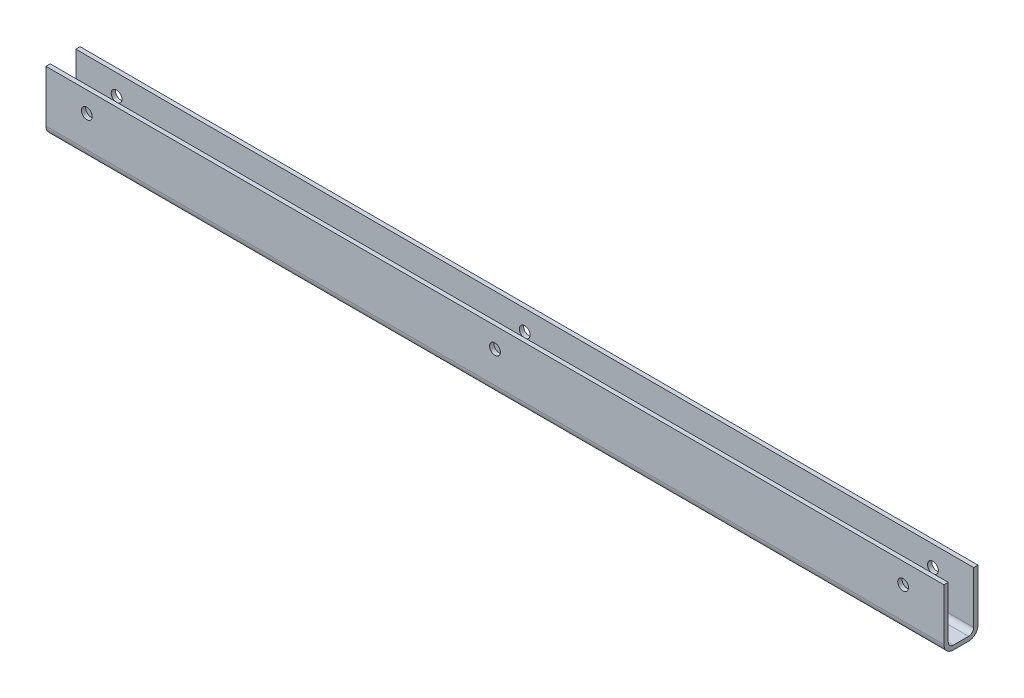
ISO-10303-21;
HEADER;
FILE_DESCRIPTION(('STEP AP214'),'2;1');
FILE_NAME('part.step','',(''),(''),'','','');
FILE_SCHEMA(('AUTOMOTIVE_DESIGN { 1 0 10303 214 1 1 1 1 }'));
ENDSEC;
DATA;
#1=APPLICATION_CONTEXT('core data for automotive mechanical design processes');
#2=APPLICATION_PROTOCOL_DEFINITION('international standard','automotive_design',2000,#1);
#3=PRODUCT_CONTEXT('',#1,'mechanical');
#4=PRODUCT('Part','Part','',(#3));
#5=PRODUCT_RELATED_PRODUCT_CATEGORY('part','',(#4));
#6=PRODUCT_DEFINITION_FORMATION('','',#4);
#7=PRODUCT_DEFINITION_CONTEXT('part definition',#1,'design');
#8=PRODUCT_DEFINITION('design','',#6,#7);
#9=PRODUCT_DEFINITION_SHAPE('','',#8);
#10=(LENGTH_UNIT() NAMED_UNIT(*) SI_UNIT(.MILLI.,.METRE.));
#11=(NAMED_UNIT(*) PLANE_ANGLE_UNIT() SI_UNIT($,.RADIAN.));
#12=(NAMED_UNIT(*) SI_UNIT($,.STERADIAN.) SOLID_ANGLE_UNIT());
#13=UNCERTAINTY_MEASURE_WITH_UNIT(LENGTH_MEASURE(1.E-05),#10,'distance_accuracy_value','');
#14=(GEOMETRIC_REPRESENTATION_CONTEXT(3) GLOBAL_UNCERTAINTY_ASSIGNED_CONTEXT((#13)) GLOBAL_UNIT_ASSIGNED_CONTEXT((#10,
#11,#12)) REPRESENTATION_CONTEXT('',''));
#15=CARTESIAN_POINT('',(0.,0.,0.));
#16=DIRECTION('',(0.,0.,1.));
#17=DIRECTION('',(1.,0.,0.));
#18=AXIS2_PLACEMENT_3D('',#15,#16,#17);
#19=CARTESIAN_POINT('',(25.4,25.4,0.));
#20=DIRECTION('',(0.,0.,1.));
#21=DIRECTION('',(1.,0.,0.));
#22=AXIS2_PLACEMENT_3D('',#19,#20,#21);
#23=CYLINDRICAL_SURFACE('',#22,3.3655);
#24=CARTESIAN_POINT('',(25.4,25.4,-2.65684));
#25=DIRECTION('',(0.,0.,1.));
#26=DIRECTION('',(1.,0.,0.));
#27=AXIS2_PLACEMENT_3D('',#24,#25,#26);
#28=CIRCLE('',#27,3.3655);
#29=CARTESIAN_POINT('',(28.7655,25.4,-2.65684));
#30=VERTEX_POINT('',#29);
#31=EDGE_CURVE('E19',#30,#30,#28,.T.);
#32=ORIENTED_EDGE('',*,*,#31,.F.);
#33=EDGE_LOOP('',(#32));
#34=FACE_BOUND('',#33,.T.);
#35=CARTESIAN_POINT('',(25.4,25.4,0.));
#36=DIRECTION('',(0.,0.,1.));
#37=DIRECTION('',(1.,0.,0.));
#38=AXIS2_PLACEMENT_3D('',#35,#36,#37);
#39=CIRCLE('',#38,3.3655);
#40=CARTESIAN_POINT('',(28.7655,25.4,0.));
#41=VERTEX_POINT('',#40);
#42=EDGE_CURVE('E143',#41,#41,#39,.F.);
#43=ORIENTED_EDGE('',*,*,#42,.F.);
#44=EDGE_LOOP('',(#43));
#45=FACE_BOUND('',#44,.T.);
#46=ADVANCED_FACE('F16',(#34,#45),#23,.F.);
#47=CARTESIAN_POINT('',(279.4,25.4,0.));
#48=DIRECTION('',(0.,0.,1.));
#49=DIRECTION('',(1.,0.,0.));
#50=AXIS2_PLACEMENT_3D('',#47,#48,#49);
#51=CYLINDRICAL_SURFACE('',#50,3.3655);
#52=CARTESIAN_POINT('',(279.4,25.4,-2.65684));
#53=DIRECTION('',(0.,0.,1.));
#54=DIRECTION('',(1.,0.,0.));
#55=AXIS2_PLACEMENT_3D('',#52,#53,#54);
#56=CIRCLE('',#55,3.3655);
#57=CARTESIAN_POINT('',(282.7655,25.4,-2.65684));
#58=VERTEX_POINT('',#57);
#59=EDGE_CURVE('E150',#58,#58,#56,.T.);
#60=ORIENTED_EDGE('',*,*,#59,.F.);
#61=EDGE_LOOP('',(#60));
#62=FACE_BOUND('',#61,.T.);
#63=CARTESIAN_POINT('',(279.4,25.4,0.));
#64=DIRECTION('',(0.,0.,1.));
#65=DIRECTION('',(1.,0.,0.));
#66=AXIS2_PLACEMENT_3D('',#63,#64,#65);
#67=CIRCLE('',#66,3.3655);
#68=CARTESIAN_POINT('',(282.7655,25.4,0.));
#69=VERTEX_POINT('',#68);
#70=EDGE_CURVE('E140',#69,#69,#67,.F.);
#71=ORIENTED_EDGE('',*,*,#70,.F.);
#72=EDGE_LOOP('',(#71));
#73=FACE_BOUND('',#72,.T.);
#74=ADVANCED_FACE('F467',(#62,#73),#51,.F.);
#75=CARTESIAN_POINT('',(533.4,25.4,0.));
#76=DIRECTION('',(0.,0.,1.));
#77=DIRECTION('',(1.,0.,0.));
#78=AXIS2_PLACEMENT_3D('',#75,#76,#77);
#79=CYLINDRICAL_SURFACE('',#78,3.3655);
#80=CARTESIAN_POINT('',(533.4,25.4,-2.65684));
#81=DIRECTION('',(0.,0.,1.));
#82=DIRECTION('',(1.,0.,0.));
#83=AXIS2_PLACEMENT_3D('',#80,#81,#82);
#84=CIRCLE('',#83,3.3655);
#85=CARTESIAN_POINT('',(536.7655,25.4,-2.65684));
#86=VERTEX_POINT('',#85);
#87=EDGE_CURVE('E147',#86,#86,#84,.T.);
#88=ORIENTED_EDGE('',*,*,#87,.F.);
#89=EDGE_LOOP('',(#88));
#90=FACE_BOUND('',#89,.T.);
#91=CARTESIAN_POINT('',(533.4,25.4,0.));
#92=DIRECTION('',(0.,0.,1.));
#93=DIRECTION('',(1.,0.,0.));
#94=AXIS2_PLACEMENT_3D('',#91,#92,#93);
#95=CIRCLE('',#94,3.3655);
#96=CARTESIAN_POINT('',(536.7655,25.4,0.));
#97=VERTEX_POINT('',#96);
#98=EDGE_CURVE('E136',#97,#97,#95,.F.);
#99=ORIENTED_EDGE('',*,*,#98,.F.);
#100=EDGE_LOOP('',(#99));
#101=FACE_BOUND('',#100,.T.);
#102=ADVANCED_FACE('F458',(#90,#101),#79,.F.);
#103=CARTESIAN_POINT('',(0.,2.65684,-18.53184));
#104=DIRECTION('',(0.,1.,0.));
#105=DIRECTION('',(0.,0.,1.));
#106=AXIS2_PLACEMENT_3D('',#103,#104,#105);
#107=PLANE('',#106);
#108=DIRECTION('',(1.,0.,0.));
#109=VECTOR('',#108,1.);
#110=CARTESIAN_POINT('',(-728.45168,2.65684,-5.83184));
#111=LINE('',#110,#109);
#112=CARTESIAN_POINT('',(0.,2.65684,-5.83184));
#113=VERTEX_POINT('',#112);
#114=CARTESIAN_POINT('',(558.8,2.65684,-5.83184));
#115=VERTEX_POINT('',#114);
#116=EDGE_CURVE('E159',#113,#115,#111,.T.);
#117=ORIENTED_EDGE('',*,*,#116,.T.);
#118=DIRECTION('',(0.,0.,-1.));
#119=VECTOR('',#118,1.);
#120=CARTESIAN_POINT('',(558.8,2.65684,0.));
#121=LINE('',#120,#119);
#122=CARTESIAN_POINT('',(558.8,2.65684,-15.35684));
#123=VERTEX_POINT('',#122);
#124=EDGE_CURVE('E212',#123,#115,#121,.F.);
#125=ORIENTED_EDGE('',*,*,#124,.F.);
#126=DIRECTION('',(1.,0.,0.));
#127=VECTOR('',#126,1.);
#128=CARTESIAN_POINT('',(-728.45168,2.65684,-15.35684));
#129=LINE('',#128,#127);
#130=CARTESIAN_POINT('',(0.,2.65684,-15.35684));
#131=VERTEX_POINT('',#130);
#132=EDGE_CURVE('E118',#123,#131,#129,.F.);
#133=ORIENTED_EDGE('',*,*,#132,.T.);
#134=DIRECTION('',(0.,0.,-1.));
#135=VECTOR('',#134,1.);
#136=CARTESIAN_POINT('',(0.,2.65684,0.));
#137=LINE('',#136,#135);
#138=EDGE_CURVE('E205',#131,#113,#137,.F.);
#139=ORIENTED_EDGE('',*,*,#138,.T.);
#140=EDGE_LOOP('',(#117,#125,#133,#139));
#141=FACE_BOUND('',#140,.T.);
#142=ADVANCED_FACE('F449',(#141),#107,.T.);
#143=CARTESIAN_POINT('',(-728.45168,5.83184,-5.83184));
#144=DIRECTION('',(1.,0.,0.));
#145=DIRECTION('',(0.,0.,-1.));
#146=AXIS2_PLACEMENT_3D('',#143,#144,#145);
#147=CYLINDRICAL_SURFACE('',#146,3.175);
#148=CARTESIAN_POINT('',(558.8,5.83184,-5.83184));
#149=DIRECTION('',(1.,0.,0.));
#150=DIRECTION('',(0.,0.,-1.));
#151=AXIS2_PLACEMENT_3D('',#148,#149,#150);
#152=CIRCLE('',#151,3.175);
#153=CARTESIAN_POINT('',(558.8,5.83184,-2.65684));
#154=VERTEX_POINT('',#153);
#155=EDGE_CURVE('E210',#115,#154,#152,.F.);
#156=ORIENTED_EDGE('',*,*,#155,.F.);
#157=ORIENTED_EDGE('',*,*,#116,.F.);
#158=CARTESIAN_POINT('',(0.,5.83184,-5.83184));
#159=DIRECTION('',(1.,0.,0.));
#160=DIRECTION('',(0.,0.,-1.));
#161=AXIS2_PLACEMENT_3D('',#158,#159,#160);
#162=CIRCLE('',#161,3.175);
#163=CARTESIAN_POINT('',(0.,5.83184,-2.65684));
#164=VERTEX_POINT('',#163);
#165=EDGE_CURVE('E202',#113,#164,#162,.F.);
#166=ORIENTED_EDGE('',*,*,#165,.T.);
#167=DIRECTION('',(-1.,0.,0.));
#168=VECTOR('',#167,1.);
#169=CARTESIAN_POINT('',(0.,5.83184,-2.65684));
#170=LINE('',#169,#168);
#171=EDGE_CURVE('E155',#154,#164,#170,.T.);
#172=ORIENTED_EDGE('',*,*,#171,.F.);
#173=EDGE_LOOP('',(#156,#157,#166,#172));
#174=FACE_BOUND('',#173,.T.);
#175=ADVANCED_FACE('F440',(#174),#147,.F.);
#176=CARTESIAN_POINT('',(0.,2.65684,-2.65684));
#177=DIRECTION('',(0.,0.,-1.));
#178=DIRECTION('',(-1.,0.,0.));
#179=AXIS2_PLACEMENT_3D('',#176,#177,#178);
#180=PLANE('',#179);
#181=ORIENTED_EDGE('',*,*,#87,.T.);
#182=EDGE_LOOP('',(#181));
#183=FACE_BOUND('',#182,.T.);
#184=ORIENTED_EDGE('',*,*,#59,.T.);
#185=EDGE_LOOP('',(#184));
#186=FACE_BOUND('',#185,.T.);
#187=ORIENTED_EDGE('',*,*,#31,.T.);
#188=EDGE_LOOP('',(#187));
#189=FACE_BOUND('',#188,.T.);
#190=DIRECTION('',(1.,0.,0.));
#191=VECTOR('',#190,1.);
#192=CARTESIAN_POINT('',(0.,38.1,-2.65684));
#193=LINE('',#192,#191);
#194=CARTESIAN_POINT('',(558.8,38.1,-2.65684));
#195=VERTEX_POINT('',#194);
#196=CARTESIAN_POINT('',(0.,38.1,-2.65684));
#197=VERTEX_POINT('',#196);
#198=EDGE_CURVE('E149',#195,#197,#193,.F.);
#199=ORIENTED_EDGE('',*,*,#198,.F.);
#200=DIRECTION('',(0.,1.,0.));
#201=VECTOR('',#200,1.);
#202=CARTESIAN_POINT('',(558.8,0.,-2.65684));
#203=LINE('',#202,#201);
#204=EDGE_CURVE('E178',#154,#195,#203,.T.);
#205=ORIENTED_EDGE('',*,*,#204,.F.);
#206=ORIENTED_EDGE('',*,*,#171,.T.);
#207=DIRECTION('',(0.,1.,0.));
#208=VECTOR('',#207,1.);
#209=CARTESIAN_POINT('',(0.,0.,-2.65684));
#210=LINE('',#209,#208);
#211=EDGE_CURVE('E204',#164,#197,#210,.T.);
#212=ORIENTED_EDGE('',*,*,#211,.T.);
#213=EDGE_LOOP('',(#199,#205,#206,#212));
#214=FACE_BOUND('',#213,.T.);
#215=ADVANCED_FACE('F432',(#183,#186,#189,#214),#180,.T.);
#216=CARTESIAN_POINT('',(0.,38.1,-2.65684));
#217=DIRECTION('',(0.,1.,0.));
#218=DIRECTION('',(0.,0.,1.));
#219=AXIS2_PLACEMENT_3D('',#216,#217,#218);
#220=PLANE('',#219);
#221=DIRECTION('',(0.,0.,-1.));
#222=VECTOR('',#221,1.);
#223=CARTESIAN_POINT('',(558.8,38.1,0.));
#224=LINE('',#223,#222);
#225=CARTESIAN_POINT('',(558.8,38.1,0.));
#226=VERTEX_POINT('',#225);
#227=EDGE_CURVE('E174',#195,#226,#224,.F.);
#228=ORIENTED_EDGE('',*,*,#227,.F.);
#229=ORIENTED_EDGE('',*,*,#198,.T.);
#230=DIRECTION('',(0.,0.,-1.));
#231=VECTOR('',#230,1.);
#232=CARTESIAN_POINT('',(0.,38.1,0.));
#233=LINE('',#232,#231);
#234=CARTESIAN_POINT('',(0.,38.1,0.));
#235=VERTEX_POINT('',#234);
#236=EDGE_CURVE('E235',#197,#235,#233,.F.);
#237=ORIENTED_EDGE('',*,*,#236,.T.);
#238=DIRECTION('',(1.,0.,0.));
#239=VECTOR('',#238,1.);
#240=CARTESIAN_POINT('',(0.,38.1,0.));
#241=LINE('',#240,#239);
#242=EDGE_CURVE('E146',#226,#235,#241,.F.);
#243=ORIENTED_EDGE('',*,*,#242,.F.);
#244=EDGE_LOOP('',(#228,#229,#237,#243));
#245=FACE_BOUND('',#244,.T.);
#246=ADVANCED_FACE('F242',(#245),#220,.T.);
#247=CARTESIAN_POINT('',(0.,38.1,0.));
#248=DIRECTION('',(0.,0.,1.));
#249=DIRECTION('',(1.,0.,0.));
#250=AXIS2_PLACEMENT_3D('',#247,#248,#249);
#251=PLANE('',#250);
#252=ORIENTED_EDGE('',*,*,#98,.T.);
#253=EDGE_LOOP('',(#252));
#254=FACE_BOUND('',#253,.T.);
#255=ORIENTED_EDGE('',*,*,#70,.T.);
#256=EDGE_LOOP('',(#255));
#257=FACE_BOUND('',#256,.T.);
#258=ORIENTED_EDGE('',*,*,#42,.T.);
#259=EDGE_LOOP('',(#258));
#260=FACE_BOUND('',#259,.T.);
#261=ORIENTED_EDGE('',*,*,#242,.T.);
#262=DIRECTION('',(0.,1.,0.));
#263=VECTOR('',#262,1.);
#264=CARTESIAN_POINT('',(0.,0.,0.));
#265=LINE('',#264,#263);
#266=CARTESIAN_POINT('',(0.,5.842,0.));
#267=VERTEX_POINT('',#266);
#268=EDGE_CURVE('E201',#235,#267,#265,.F.);
#269=ORIENTED_EDGE('',*,*,#268,.T.);
#270=DIRECTION('',(-1.,0.,0.));
#271=VECTOR('',#270,1.);
#272=CARTESIAN_POINT('',(1287.25168,5.842,0.));
#273=LINE('',#272,#271);
#274=CARTESIAN_POINT('',(558.8,5.842,0.));
#275=VERTEX_POINT('',#274);
#276=EDGE_CURVE('E139',#275,#267,#273,.T.);
#277=ORIENTED_EDGE('',*,*,#276,.F.);
#278=DIRECTION('',(0.,1.,0.));
#279=VECTOR('',#278,1.);
#280=CARTESIAN_POINT('',(558.8,0.,0.));
#281=LINE('',#280,#279);
#282=EDGE_CURVE('E177',#226,#275,#281,.F.);
#283=ORIENTED_EDGE('',*,*,#282,.F.);
#284=EDGE_LOOP('',(#261,#269,#277,#283));
#285=FACE_BOUND('',#284,.T.);
#286=ADVANCED_FACE('F290',(#254,#257,#260,#285),#251,.T.);
#287=CARTESIAN_POINT('',(1287.25168,5.842,-5.842));
#288=DIRECTION('',(-1.,0.,0.));
#289=DIRECTION('',(0.,0.,1.));
#290=AXIS2_PLACEMENT_3D('',#287,#288,#289);
#291=CYLINDRICAL_SURFACE('',#290,5.842);
#292=CARTESIAN_POINT('',(558.8,5.842,-5.842));
#293=DIRECTION('',(-1.,0.,0.));
#294=DIRECTION('',(0.,0.,1.));
#295=AXIS2_PLACEMENT_3D('',#292,#293,#294);
#296=CIRCLE('',#295,5.842);
#297=CARTESIAN_POINT('',(558.8,0.,-5.842));
#298=VERTEX_POINT('',#297);
#299=EDGE_CURVE('E209',#275,#298,#296,.F.);
#300=ORIENTED_EDGE('',*,*,#299,.F.);
#301=ORIENTED_EDGE('',*,*,#276,.T.);
#302=CARTESIAN_POINT('',(0.,5.842,-5.842));
#303=DIRECTION('',(-1.,0.,0.));
#304=DIRECTION('',(0.,0.,1.));
#305=AXIS2_PLACEMENT_3D('',#302,#303,#304);
#306=CIRCLE('',#305,5.842);
#307=CARTESIAN_POINT('',(0.,0.,-5.842));
#308=VERTEX_POINT('',#307);
#309=EDGE_CURVE('E199',#267,#308,#306,.F.);
#310=ORIENTED_EDGE('',*,*,#309,.T.);
#311=DIRECTION('',(1.,0.,0.));
#312=VECTOR('',#311,1.);
#313=CARTESIAN_POINT('',(0.,0.,-5.842));
#314=LINE('',#313,#312);
#315=EDGE_CURVE('E226',#298,#308,#314,.F.);
#316=ORIENTED_EDGE('',*,*,#315,.F.);
#317=EDGE_LOOP('',(#300,#301,#310,#316));
#318=FACE_BOUND('',#317,.T.);
#319=ADVANCED_FACE('F292',(#318),#291,.T.);
#320=CARTESIAN_POINT('',(0.,0.,0.));
#321=DIRECTION('',(0.,-1.,0.));
#322=DIRECTION('',(0.,0.,-1.));
#323=AXIS2_PLACEMENT_3D('',#320,#321,#322);
#324=PLANE('',#323);
#325=ORIENTED_EDGE('',*,*,#315,.T.);
#326=DIRECTION('',(0.,0.,-1.));
#327=VECTOR('',#326,1.);
#328=CARTESIAN_POINT('',(0.,0.,0.));
#329=LINE('',#328,#327);
#330=CARTESIAN_POINT('',(0.,0.,-15.34668));
#331=VERTEX_POINT('',#330);
#332=EDGE_CURVE('E198',#308,#331,#329,.T.);
#333=ORIENTED_EDGE('',*,*,#332,.T.);
#334=DIRECTION('',(-1.,0.,0.));
#335=VECTOR('',#334,1.);
#336=CARTESIAN_POINT('',(1287.25168,0.,-15.34668));
#337=LINE('',#336,#335);
#338=CARTESIAN_POINT('',(558.8,0.,-15.34668));
#339=VERTEX_POINT('',#338);
#340=EDGE_CURVE('E103',#339,#331,#337,.T.);
#341=ORIENTED_EDGE('',*,*,#340,.F.);
#342=DIRECTION('',(0.,0.,-1.));
#343=VECTOR('',#342,1.);
#344=CARTESIAN_POINT('',(558.8,0.,0.));
#345=LINE('',#344,#343);
#346=EDGE_CURVE('E130',#298,#339,#345,.T.);
#347=ORIENTED_EDGE('',*,*,#346,.F.);
#348=EDGE_LOOP('',(#325,#333,#341,#347));
#349=FACE_BOUND('',#348,.T.);
#350=ADVANCED_FACE('F293',(#349),#324,.T.);
#351=CARTESIAN_POINT('',(1287.25168,5.842,-15.34668));
#352=DIRECTION('',(-1.,0.,0.));
#353=DIRECTION('',(0.,0.,1.));
#354=AXIS2_PLACEMENT_3D('',#351,#352,#353);
#355=CYLINDRICAL_SURFACE('',#354,5.842);
#356=CARTESIAN_POINT('',(558.8,5.842,-15.34668));
#357=DIRECTION('',(-1.,0.,0.));
#358=DIRECTION('',(0.,0.,1.));
#359=AXIS2_PLACEMENT_3D('',#356,#357,#358);
#360=CIRCLE('',#359,5.842);
#361=CARTESIAN_POINT('',(558.8,5.842,-21.18868));
#362=VERTEX_POINT('',#361);
#363=EDGE_CURVE('E112',#339,#362,#360,.F.);
#364=ORIENTED_EDGE('',*,*,#363,.F.);
#365=ORIENTED_EDGE('',*,*,#340,.T.);
#366=CARTESIAN_POINT('',(0.,5.842,-15.34668));
#367=DIRECTION('',(-1.,0.,0.));
#368=DIRECTION('',(0.,0.,1.));
#369=AXIS2_PLACEMENT_3D('',#366,#367,#368);
#370=CIRCLE('',#369,5.842);
#371=CARTESIAN_POINT('',(0.,5.842,-21.18868));
#372=VERTEX_POINT('',#371);
#373=EDGE_CURVE('E115',#331,#372,#370,.F.);
#374=ORIENTED_EDGE('',*,*,#373,.T.);
#375=DIRECTION('',(-1.,0.,0.));
#376=VECTOR('',#375,1.);
#377=CARTESIAN_POINT('',(0.,5.842,-21.18868));
#378=LINE('',#377,#376);
#379=EDGE_CURVE('E108',#362,#372,#378,.T.);
#380=ORIENTED_EDGE('',*,*,#379,.F.);
#381=EDGE_LOOP('',(#364,#365,#374,#380));
#382=FACE_BOUND('',#381,.T.);
#383=ADVANCED_FACE('F110',(#382),#355,.T.);
#384=CARTESIAN_POINT('',(0.,0.,-21.18868));
#385=DIRECTION('',(0.,0.,-1.));
#386=DIRECTION('',(-1.,0.,0.));
#387=AXIS2_PLACEMENT_3D('',#384,#385,#386);
#388=PLANE('',#387);
#389=CARTESIAN_POINT('',(533.4,25.4,-21.18868));
#390=DIRECTION('',(0.,0.,1.));
#391=DIRECTION('',(1.,0.,0.));
#392=AXIS2_PLACEMENT_3D('',#389,#390,#391);
#393=CIRCLE('',#392,3.3655);
#394=CARTESIAN_POINT('',(536.7655,25.4,-21.18868));
#395=VERTEX_POINT('',#394);
#396=EDGE_CURVE('E187',#395,#395,#393,.T.);
#397=ORIENTED_EDGE('',*,*,#396,.T.);
#398=EDGE_LOOP('',(#397));
#399=FACE_BOUND('',#398,.T.);
#400=CARTESIAN_POINT('',(279.4,25.4,-21.18868));
#401=DIRECTION('',(0.,0.,1.));
#402=DIRECTION('',(1.,0.,0.));
#403=AXIS2_PLACEMENT_3D('',#400,#401,#402);
#404=CIRCLE('',#403,3.3655);
#405=CARTESIAN_POINT('',(282.7655,25.4,-21.18868));
#406=VERTEX_POINT('',#405);
#407=EDGE_CURVE('E191',#406,#406,#404,.T.);
#408=ORIENTED_EDGE('',*,*,#407,.T.);
#409=EDGE_LOOP('',(#408));
#410=FACE_BOUND('',#409,.T.);
#411=CARTESIAN_POINT('',(25.4,25.4,-21.18868));
#412=DIRECTION('',(0.,0.,1.));
#413=DIRECTION('',(1.,0.,0.));
#414=AXIS2_PLACEMENT_3D('',#411,#412,#413);
#415=CIRCLE('',#414,3.3655);
#416=CARTESIAN_POINT('',(28.7655,25.4,-21.18868));
#417=VERTEX_POINT('',#416);
#418=EDGE_CURVE('E194',#417,#417,#415,.T.);
#419=ORIENTED_EDGE('',*,*,#418,.T.);
#420=EDGE_LOOP('',(#419));
#421=FACE_BOUND('',#420,.T.);
#422=DIRECTION('',(1.,0.,0.));
#423=VECTOR('',#422,1.);
#424=CARTESIAN_POINT('',(0.,38.1,-21.18868));
#425=LINE('',#424,#423);
#426=CARTESIAN_POINT('',(558.8,38.1,-21.18868));
#427=VERTEX_POINT('',#426);
#428=CARTESIAN_POINT('',(0.,38.1,-21.18868));
#429=VERTEX_POINT('',#428);
#430=EDGE_CURVE('E123',#427,#429,#425,.F.);
#431=ORIENTED_EDGE('',*,*,#430,.F.);
#432=DIRECTION('',(0.,1.,0.));
#433=VECTOR('',#432,1.);
#434=CARTESIAN_POINT('',(558.8,0.,-21.18868));
#435=LINE('',#434,#433);
#436=EDGE_CURVE('E121',#362,#427,#435,.T.);
#437=ORIENTED_EDGE('',*,*,#436,.F.);
#438=ORIENTED_EDGE('',*,*,#379,.T.);
#439=DIRECTION('',(0.,1.,0.));
#440=VECTOR('',#439,1.);
#441=CARTESIAN_POINT('',(0.,0.,-21.18868));
#442=LINE('',#441,#440);
#443=EDGE_CURVE('E170',#372,#429,#442,.T.);
#444=ORIENTED_EDGE('',*,*,#443,.T.);
#445=EDGE_LOOP('',(#431,#437,#438,#444));
#446=FACE_BOUND('',#445,.T.);
#447=ADVANCED_FACE('F122',(#399,#410,#421,#446),#388,.T.);
#448=CARTESIAN_POINT('',(-728.45168,5.83184,-15.35684));
#449=DIRECTION('',(1.,0.,0.));
#450=DIRECTION('',(0.,0.,-1.));
#451=AXIS2_PLACEMENT_3D('',#448,#449,#450);
#452=CYLINDRICAL_SURFACE('',#451,3.175);
#453=CARTESIAN_POINT('',(558.8,5.83184,-15.35684));
#454=DIRECTION('',(1.,0.,0.));
#455=DIRECTION('',(0.,0.,-1.));
#456=AXIS2_PLACEMENT_3D('',#453,#454,#455);
#457=CIRCLE('',#456,3.175);
#458=CARTESIAN_POINT('',(558.8,5.83184,-18.53184));
#459=VERTEX_POINT('',#458);
#460=EDGE_CURVE('E126',#459,#123,#457,.F.);
#461=ORIENTED_EDGE('',*,*,#460,.F.);
#462=DIRECTION('',(1.,0.,0.));
#463=VECTOR('',#462,1.);
#464=CARTESIAN_POINT('',(0.,5.83184,-18.53184));
#465=LINE('',#464,#463);
#466=CARTESIAN_POINT('',(0.,5.83184,-18.53184));
#467=VERTEX_POINT('',#466);
#468=EDGE_CURVE('E190',#467,#459,#465,.T.);
#469=ORIENTED_EDGE('',*,*,#468,.F.);
#470=CARTESIAN_POINT('',(0.,5.83184,-15.35684));
#471=DIRECTION('',(1.,0.,0.));
#472=DIRECTION('',(0.,0.,-1.));
#473=AXIS2_PLACEMENT_3D('',#470,#471,#472);
#474=CIRCLE('',#473,3.175);
#475=EDGE_CURVE('E206',#467,#131,#474,.F.);
#476=ORIENTED_EDGE('',*,*,#475,.T.);
#477=ORIENTED_EDGE('',*,*,#132,.F.);
#478=EDGE_LOOP('',(#461,#469,#476,#477));
#479=FACE_BOUND('',#478,.T.);
#480=ADVANCED_FACE('F330',(#479),#452,.F.);
#481=CARTESIAN_POINT('',(558.8,0.,0.));
#482=DIRECTION('',(1.,0.,0.));
#483=DIRECTION('',(0.,0.,-1.));
#484=AXIS2_PLACEMENT_3D('',#481,#482,#483);
#485=PLANE('',#484);
#486=ORIENTED_EDGE('',*,*,#299,.T.);
#487=ORIENTED_EDGE('',*,*,#346,.T.);
#488=ORIENTED_EDGE('',*,*,#363,.T.);
#489=ORIENTED_EDGE('',*,*,#436,.T.);
#490=DIRECTION('',(0.,0.,1.));
#491=VECTOR('',#490,1.);
#492=CARTESIAN_POINT('',(558.8,38.1,-21.18868));
#493=LINE('',#492,#491);
#494=CARTESIAN_POINT('',(558.8,38.1,-18.53184));
#495=VERTEX_POINT('',#494);
#496=EDGE_CURVE('E171',#495,#427,#493,.F.);
#497=ORIENTED_EDGE('',*,*,#496,.F.);
#498=DIRECTION('',(0.,1.,0.));
#499=VECTOR('',#498,1.);
#500=CARTESIAN_POINT('',(558.8,38.1,-18.53184));
#501=LINE('',#500,#499);
#502=EDGE_CURVE('E264',#459,#495,#501,.T.);
#503=ORIENTED_EDGE('',*,*,#502,.F.);
#504=ORIENTED_EDGE('',*,*,#460,.T.);
#505=ORIENTED_EDGE('',*,*,#124,.T.);
#506=ORIENTED_EDGE('',*,*,#155,.T.);
#507=ORIENTED_EDGE('',*,*,#204,.T.);
#508=ORIENTED_EDGE('',*,*,#227,.T.);
#509=ORIENTED_EDGE('',*,*,#282,.T.);
#510=EDGE_LOOP('',(#486,#487,#488,#489,#497,#503,#504,#505,#506,#507,#508,#509));
#511=FACE_BOUND('',#510,.T.);
#512=ADVANCED_FACE('F129',(#511),#485,.T.);
#513=CARTESIAN_POINT('',(0.,38.1,-21.18868));
#514=DIRECTION('',(0.,1.,0.));
#515=DIRECTION('',(0.,0.,1.));
#516=AXIS2_PLACEMENT_3D('',#513,#514,#515);
#517=PLANE('',#516);
#518=ORIENTED_EDGE('',*,*,#496,.T.);
#519=ORIENTED_EDGE('',*,*,#430,.T.);
#520=DIRECTION('',(0.,0.,-1.));
#521=VECTOR('',#520,1.);
#522=CARTESIAN_POINT('',(0.,38.1,0.));
#523=LINE('',#522,#521);
#524=CARTESIAN_POINT('',(0.,38.1,-18.53184));
#525=VERTEX_POINT('',#524);
#526=EDGE_CURVE('E34',#429,#525,#523,.F.);
#527=ORIENTED_EDGE('',*,*,#526,.T.);
#528=DIRECTION('',(1.,0.,0.));
#529=VECTOR('',#528,1.);
#530=CARTESIAN_POINT('',(0.,38.1,-18.53184));
#531=LINE('',#530,#529);
#532=EDGE_CURVE('E267',#495,#525,#531,.F.);
#533=ORIENTED_EDGE('',*,*,#532,.F.);
#534=EDGE_LOOP('',(#518,#519,#527,#533));
#535=FACE_BOUND('',#534,.T.);
#536=ADVANCED_FACE('F325',(#535),#517,.T.);
#537=CARTESIAN_POINT('',(0.,0.,0.));
#538=DIRECTION('',(1.,0.,0.));
#539=DIRECTION('',(0.,0.,-1.));
#540=AXIS2_PLACEMENT_3D('',#537,#538,#539);
#541=PLANE('',#540);
#542=ORIENTED_EDGE('',*,*,#332,.F.);
#543=ORIENTED_EDGE('',*,*,#309,.F.);
#544=ORIENTED_EDGE('',*,*,#268,.F.);
#545=ORIENTED_EDGE('',*,*,#236,.F.);
#546=ORIENTED_EDGE('',*,*,#211,.F.);
#547=ORIENTED_EDGE('',*,*,#165,.F.);
#548=ORIENTED_EDGE('',*,*,#138,.F.);
#549=ORIENTED_EDGE('',*,*,#475,.F.);
#550=DIRECTION('',(0.,1.,0.));
#551=VECTOR('',#550,1.);
#552=CARTESIAN_POINT('',(0.,38.1,-18.53184));
#553=LINE('',#552,#551);
#554=EDGE_CURVE('E186',#525,#467,#553,.F.);
#555=ORIENTED_EDGE('',*,*,#554,.F.);
#556=ORIENTED_EDGE('',*,*,#526,.F.);
#557=ORIENTED_EDGE('',*,*,#443,.F.);
#558=ORIENTED_EDGE('',*,*,#373,.F.);
#559=EDGE_LOOP('',(#542,#543,#544,#545,#546,#547,#548,#549,#555,#556,#557,#558));
#560=FACE_BOUND('',#559,.T.);
#561=ADVANCED_FACE('F246',(#560),#541,.F.);
#562=CARTESIAN_POINT('',(25.4,25.4,0.));
#563=DIRECTION('',(0.,0.,1.));
#564=DIRECTION('',(1.,0.,0.));
#565=AXIS2_PLACEMENT_3D('',#562,#563,#564);
#566=CYLINDRICAL_SURFACE('',#565,3.3655);
#567=CARTESIAN_POINT('',(25.4,25.4,-18.53184));
#568=DIRECTION('',(0.,0.,1.));
#569=DIRECTION('',(1.,0.,0.));
#570=AXIS2_PLACEMENT_3D('',#567,#568,#569);
#571=CIRCLE('',#570,3.3655);
#572=CARTESIAN_POINT('',(28.7655,25.4,-18.53184));
#573=VERTEX_POINT('',#572);
#574=EDGE_CURVE('E183',#573,#573,#571,.F.);
#575=ORIENTED_EDGE('',*,*,#574,.F.);
#576=EDGE_LOOP('',(#575));
#577=FACE_BOUND('',#576,.T.);
#578=ORIENTED_EDGE('',*,*,#418,.F.);
#579=EDGE_LOOP('',(#578));
#580=FACE_BOUND('',#579,.T.);
#581=ADVANCED_FACE('F318',(#577,#580),#566,.F.);
#582=CARTESIAN_POINT('',(279.4,25.4,0.));
#583=DIRECTION('',(0.,0.,1.));
#584=DIRECTION('',(1.,0.,0.));
#585=AXIS2_PLACEMENT_3D('',#582,#583,#584);
#586=CYLINDRICAL_SURFACE('',#585,3.3655);
#587=CARTESIAN_POINT('',(279.4,25.4,-18.53184));
#588=DIRECTION('',(0.,0.,1.));
#589=DIRECTION('',(1.,0.,0.));
#590=AXIS2_PLACEMENT_3D('',#587,#588,#589);
#591=CIRCLE('',#590,3.3655);
#592=CARTESIAN_POINT('',(282.7655,25.4,-18.53184));
#593=VERTEX_POINT('',#592);
#594=EDGE_CURVE('E25',#593,#593,#591,.F.);
#595=ORIENTED_EDGE('',*,*,#594,.F.);
#596=EDGE_LOOP('',(#595));
#597=FACE_BOUND('',#596,.T.);
#598=ORIENTED_EDGE('',*,*,#407,.F.);
#599=EDGE_LOOP('',(#598));
#600=FACE_BOUND('',#599,.T.);
#601=ADVANCED_FACE('F311',(#597,#600),#586,.F.);
#602=CARTESIAN_POINT('',(533.4,25.4,0.));
#603=DIRECTION('',(0.,0.,1.));
#604=DIRECTION('',(1.,0.,0.));
#605=AXIS2_PLACEMENT_3D('',#602,#603,#604);
#606=CYLINDRICAL_SURFACE('',#605,3.3655);
#607=CARTESIAN_POINT('',(533.4,25.4,-18.53184));
#608=DIRECTION('',(0.,0.,1.));
#609=DIRECTION('',(1.,0.,0.));
#610=AXIS2_PLACEMENT_3D('',#607,#608,#609);
#611=CIRCLE('',#610,3.3655);
#612=CARTESIAN_POINT('',(536.7655,25.4,-18.53184));
#613=VERTEX_POINT('',#612);
#614=EDGE_CURVE('E11',#613,#613,#611,.F.);
#615=ORIENTED_EDGE('',*,*,#614,.F.);
#616=EDGE_LOOP('',(#615));
#617=FACE_BOUND('',#616,.T.);
#618=ORIENTED_EDGE('',*,*,#396,.F.);
#619=EDGE_LOOP('',(#618));
#620=FACE_BOUND('',#619,.T.);
#621=ADVANCED_FACE('F305',(#617,#620),#606,.F.);
#622=CARTESIAN_POINT('',(0.,38.1,-18.53184));
#623=DIRECTION('',(0.,0.,1.));
#624=DIRECTION('',(1.,0.,0.));
#625=AXIS2_PLACEMENT_3D('',#622,#623,#624);
#626=PLANE('',#625);
#627=ORIENTED_EDGE('',*,*,#614,.T.);
#628=EDGE_LOOP('',(#627));
#629=FACE_BOUND('',#628,.T.);
#630=ORIENTED_EDGE('',*,*,#594,.T.);
#631=EDGE_LOOP('',(#630));
#632=FACE_BOUND('',#631,.T.);
#633=ORIENTED_EDGE('',*,*,#574,.T.);
#634=EDGE_LOOP('',(#633));
#635=FACE_BOUND('',#634,.T.);
#636=ORIENTED_EDGE('',*,*,#532,.T.);
#637=ORIENTED_EDGE('',*,*,#554,.T.);
#638=ORIENTED_EDGE('',*,*,#468,.T.);
#639=ORIENTED_EDGE('',*,*,#502,.T.);
#640=EDGE_LOOP('',(#636,#637,#638,#639));
#641=FACE_BOUND('',#640,.T.);
#642=ADVANCED_FACE('F303',(#629,#632,#635,#641),#626,.T.);
#643=CLOSED_SHELL('',(#46,#74,#102,#142,#175,#215,#246,#286,#319,#350,#383,#447,#480,#512,#536,
#561,#581,#601,#621,#642));
#644=MANIFOLD_SOLID_BREP('B1',#643);
#645=ADVANCED_BREP_SHAPE_REPRESENTATION('',(#18,#644),#14);
#646=SHAPE_DEFINITION_REPRESENTATION(#9,#645);
ENDSEC;
END-ISO-10303-21;
